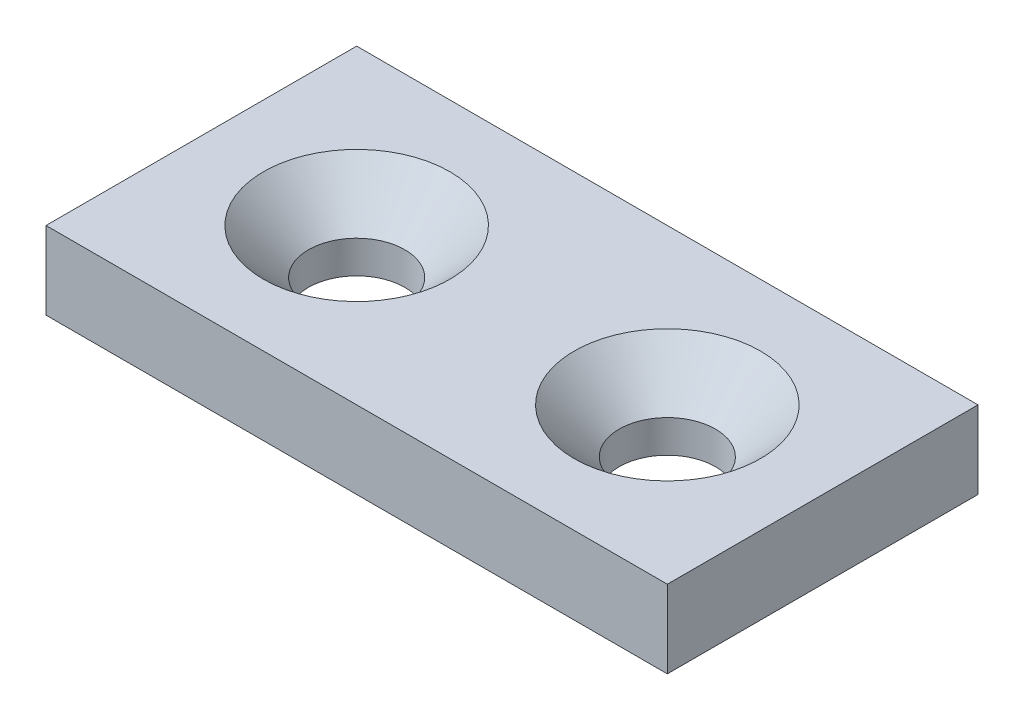
ISO-10303-21;
HEADER;
FILE_DESCRIPTION(('STEP AP214'),'2;1');
FILE_NAME('part.step','',(''),(''),'','','');
FILE_SCHEMA(('AUTOMOTIVE_DESIGN { 1 0 10303 214 1 1 1 1 }'));
ENDSEC;
DATA;
#1=APPLICATION_CONTEXT('core data for automotive mechanical design processes');
#2=APPLICATION_PROTOCOL_DEFINITION('international standard','automotive_design',2000,#1);
#3=PRODUCT_CONTEXT('',#1,'mechanical');
#4=PRODUCT('Part','Part','',(#3));
#5=PRODUCT_RELATED_PRODUCT_CATEGORY('part','',(#4));
#6=PRODUCT_DEFINITION_FORMATION('','',#4);
#7=PRODUCT_DEFINITION_CONTEXT('part definition',#1,'design');
#8=PRODUCT_DEFINITION('design','',#6,#7);
#9=PRODUCT_DEFINITION_SHAPE('','',#8);
#10=(LENGTH_UNIT() NAMED_UNIT(*) SI_UNIT(.MILLI.,.METRE.));
#11=(NAMED_UNIT(*) PLANE_ANGLE_UNIT() SI_UNIT($,.RADIAN.));
#12=(NAMED_UNIT(*) SI_UNIT($,.STERADIAN.) SOLID_ANGLE_UNIT());
#13=UNCERTAINTY_MEASURE_WITH_UNIT(LENGTH_MEASURE(1.E-05),#10,'distance_accuracy_value','');
#14=(GEOMETRIC_REPRESENTATION_CONTEXT(3) GLOBAL_UNCERTAINTY_ASSIGNED_CONTEXT((#13)) GLOBAL_UNIT_ASSIGNED_CONTEXT((#10,
#11,#12)) REPRESENTATION_CONTEXT('',''));
#15=CARTESIAN_POINT('',(0.,0.,0.));
#16=DIRECTION('',(0.,0.,1.));
#17=DIRECTION('',(1.,0.,0.));
#18=AXIS2_PLACEMENT_3D('',#15,#16,#17);
#19=CARTESIAN_POINT('',(0.,5.,0.));
#20=DIRECTION('',(0.,-1.,0.));
#21=DIRECTION('',(0.,0.,-1.));
#22=AXIS2_PLACEMENT_3D('',#19,#20,#21);
#23=PLANE('',#22);
#24=CARTESIAN_POINT('',(10.,5.,0.));
#25=DIRECTION('',(0.,1.,0.));
#26=DIRECTION('',(0.,0.,1.));
#27=AXIS2_PLACEMENT_3D('',#24,#25,#26);
#28=CIRCLE('',#27,6.);
#29=CARTESIAN_POINT('',(10.,5.,6.));
#30=VERTEX_POINT('',#29);
#31=EDGE_CURVE('E117',#30,#30,#28,.T.);
#32=ORIENTED_EDGE('',*,*,#31,.F.);
#33=EDGE_LOOP('',(#32));
#34=FACE_BOUND('',#33,.T.);
#35=DIRECTION('',(0.,0.,-1.));
#36=VECTOR('',#35,1.);
#37=CARTESIAN_POINT('',(20.,5.,10.));
#38=LINE('',#37,#36);
#39=CARTESIAN_POINT('',(20.,5.,10.));
#40=VERTEX_POINT('',#39);
#41=CARTESIAN_POINT('',(20.,5.,-10.));
#42=VERTEX_POINT('',#41);
#43=EDGE_CURVE('E86',#40,#42,#38,.T.);
#44=ORIENTED_EDGE('',*,*,#43,.T.);
#45=DIRECTION('',(-1.,0.,0.));
#46=VECTOR('',#45,1.);
#47=CARTESIAN_POINT('',(-20.,5.,-10.));
#48=LINE('',#47,#46);
#49=CARTESIAN_POINT('',(-20.,5.,-10.));
#50=VERTEX_POINT('',#49);
#51=EDGE_CURVE('E81',#42,#50,#48,.T.);
#52=ORIENTED_EDGE('',*,*,#51,.T.);
#53=DIRECTION('',(0.,0.,1.));
#54=VECTOR('',#53,1.);
#55=CARTESIAN_POINT('',(-20.,5.,10.));
#56=LINE('',#55,#54);
#57=CARTESIAN_POINT('',(-20.,5.,10.));
#58=VERTEX_POINT('',#57);
#59=EDGE_CURVE('E84',#50,#58,#56,.T.);
#60=ORIENTED_EDGE('',*,*,#59,.T.);
#61=DIRECTION('',(1.,0.,0.));
#62=VECTOR('',#61,1.);
#63=CARTESIAN_POINT('',(-20.,5.,10.));
#64=LINE('',#63,#62);
#65=EDGE_CURVE('E51',#58,#40,#64,.T.);
#66=ORIENTED_EDGE('',*,*,#65,.T.);
#67=EDGE_LOOP('',(#44,#52,#60,#66));
#68=FACE_BOUND('',#67,.T.);
#69=CARTESIAN_POINT('',(-10.,5.,0.));
#70=DIRECTION('',(0.,1.,0.));
#71=DIRECTION('',(0.,0.,1.));
#72=AXIS2_PLACEMENT_3D('',#69,#70,#71);
#73=CIRCLE('',#72,6.);
#74=CARTESIAN_POINT('',(-10.,5.,6.));
#75=VERTEX_POINT('',#74);
#76=EDGE_CURVE('E126',#75,#75,#73,.T.);
#77=ORIENTED_EDGE('',*,*,#76,.F.);
#78=EDGE_LOOP('',(#77));
#79=FACE_BOUND('',#78,.T.);
#80=ADVANCED_FACE('F34',(#34,#68,#79),#23,.F.);
#81=CARTESIAN_POINT('',(20.,5.,10.));
#82=DIRECTION('',(-1.,0.,0.));
#83=DIRECTION('',(0.,0.,1.));
#84=AXIS2_PLACEMENT_3D('',#81,#82,#83);
#85=PLANE('',#84);
#86=DIRECTION('',(0.,0.,-1.));
#87=VECTOR('',#86,1.);
#88=CARTESIAN_POINT('',(20.,0.,10.));
#89=LINE('',#88,#87);
#90=CARTESIAN_POINT('',(20.,0.,10.));
#91=VERTEX_POINT('',#90);
#92=CARTESIAN_POINT('',(20.,0.,-10.));
#93=VERTEX_POINT('',#92);
#94=EDGE_CURVE('E98',#91,#93,#89,.T.);
#95=ORIENTED_EDGE('',*,*,#94,.T.);
#96=DIRECTION('',(0.,-1.,0.));
#97=VECTOR('',#96,1.);
#98=CARTESIAN_POINT('',(20.,5.,-10.));
#99=LINE('',#98,#97);
#100=EDGE_CURVE('E11',#42,#93,#99,.T.);
#101=ORIENTED_EDGE('',*,*,#100,.F.);
#102=ORIENTED_EDGE('',*,*,#43,.F.);
#103=DIRECTION('',(0.,-1.,0.));
#104=VECTOR('',#103,1.);
#105=CARTESIAN_POINT('',(20.,5.,10.));
#106=LINE('',#105,#104);
#107=EDGE_CURVE('E94',#40,#91,#106,.T.);
#108=ORIENTED_EDGE('',*,*,#107,.T.);
#109=EDGE_LOOP('',(#95,#101,#102,#108));
#110=FACE_BOUND('',#109,.T.);
#111=ADVANCED_FACE('F36',(#110),#85,.F.);
#112=CARTESIAN_POINT('',(-20.,5.,-10.));
#113=DIRECTION('',(0.,0.,1.));
#114=DIRECTION('',(1.,0.,0.));
#115=AXIS2_PLACEMENT_3D('',#112,#113,#114);
#116=PLANE('',#115);
#117=DIRECTION('',(-1.,0.,0.));
#118=VECTOR('',#117,1.);
#119=CARTESIAN_POINT('',(-20.,0.,-10.));
#120=LINE('',#119,#118);
#121=CARTESIAN_POINT('',(-20.,0.,-10.));
#122=VERTEX_POINT('',#121);
#123=EDGE_CURVE('E90',#93,#122,#120,.T.);
#124=ORIENTED_EDGE('',*,*,#123,.T.);
#125=DIRECTION('',(0.,-1.,0.));
#126=VECTOR('',#125,1.);
#127=CARTESIAN_POINT('',(-20.,5.,-10.));
#128=LINE('',#127,#126);
#129=EDGE_CURVE('E43',#50,#122,#128,.T.);
#130=ORIENTED_EDGE('',*,*,#129,.F.);
#131=ORIENTED_EDGE('',*,*,#51,.F.);
#132=ORIENTED_EDGE('',*,*,#100,.T.);
#133=EDGE_LOOP('',(#124,#130,#131,#132));
#134=FACE_BOUND('',#133,.T.);
#135=ADVANCED_FACE('F89',(#134),#116,.F.);
#136=CARTESIAN_POINT('',(-20.,5.,10.));
#137=DIRECTION('',(1.,0.,0.));
#138=DIRECTION('',(0.,0.,-1.));
#139=AXIS2_PLACEMENT_3D('',#136,#137,#138);
#140=PLANE('',#139);
#141=DIRECTION('',(0.,0.,1.));
#142=VECTOR('',#141,1.);
#143=CARTESIAN_POINT('',(-20.,0.,10.));
#144=LINE('',#143,#142);
#145=CARTESIAN_POINT('',(-20.,0.,10.));
#146=VERTEX_POINT('',#145);
#147=EDGE_CURVE('E68',#122,#146,#144,.T.);
#148=ORIENTED_EDGE('',*,*,#147,.T.);
#149=DIRECTION('',(0.,-1.,0.));
#150=VECTOR('',#149,1.);
#151=CARTESIAN_POINT('',(-20.,5.,10.));
#152=LINE('',#151,#150);
#153=EDGE_CURVE('E91',#58,#146,#152,.T.);
#154=ORIENTED_EDGE('',*,*,#153,.F.);
#155=ORIENTED_EDGE('',*,*,#59,.F.);
#156=ORIENTED_EDGE('',*,*,#129,.T.);
#157=EDGE_LOOP('',(#148,#154,#155,#156));
#158=FACE_BOUND('',#157,.T.);
#159=ADVANCED_FACE('F92',(#158),#140,.F.);
#160=CARTESIAN_POINT('',(-20.,5.,10.));
#161=DIRECTION('',(0.,0.,-1.));
#162=DIRECTION('',(-1.,0.,0.));
#163=AXIS2_PLACEMENT_3D('',#160,#161,#162);
#164=PLANE('',#163);
#165=DIRECTION('',(1.,0.,0.));
#166=VECTOR('',#165,1.);
#167=CARTESIAN_POINT('',(-20.,0.,10.));
#168=LINE('',#167,#166);
#169=EDGE_CURVE('E74',#146,#91,#168,.T.);
#170=ORIENTED_EDGE('',*,*,#169,.T.);
#171=ORIENTED_EDGE('',*,*,#107,.F.);
#172=ORIENTED_EDGE('',*,*,#65,.F.);
#173=ORIENTED_EDGE('',*,*,#153,.T.);
#174=EDGE_LOOP('',(#170,#171,#172,#173));
#175=FACE_BOUND('',#174,.T.);
#176=ADVANCED_FACE('F106',(#175),#164,.F.);
#177=CARTESIAN_POINT('',(0.,0.,0.));
#178=DIRECTION('',(0.,-1.,0.));
#179=DIRECTION('',(0.,0.,-1.));
#180=AXIS2_PLACEMENT_3D('',#177,#178,#179);
#181=PLANE('',#180);
#182=CARTESIAN_POINT('',(-10.,0.,0.));
#183=DIRECTION('',(0.,-1.,0.));
#184=DIRECTION('',(0.,0.,-1.));
#185=AXIS2_PLACEMENT_3D('',#182,#183,#184);
#186=CIRCLE('',#185,3.1);
#187=CARTESIAN_POINT('',(-10.,0.,-3.1));
#188=VERTEX_POINT('',#187);
#189=EDGE_CURVE('E120',#188,#188,#186,.T.);
#190=ORIENTED_EDGE('',*,*,#189,.F.);
#191=EDGE_LOOP('',(#190));
#192=FACE_BOUND('',#191,.T.);
#193=CARTESIAN_POINT('',(10.,0.,0.));
#194=DIRECTION('',(0.,-1.,0.));
#195=DIRECTION('',(0.,0.,-1.));
#196=AXIS2_PLACEMENT_3D('',#193,#194,#195);
#197=CIRCLE('',#196,3.1);
#198=CARTESIAN_POINT('',(10.,0.,-3.1));
#199=VERTEX_POINT('',#198);
#200=EDGE_CURVE('E101',#199,#199,#197,.T.);
#201=ORIENTED_EDGE('',*,*,#200,.F.);
#202=EDGE_LOOP('',(#201));
#203=FACE_BOUND('',#202,.T.);
#204=ORIENTED_EDGE('',*,*,#94,.F.);
#205=ORIENTED_EDGE('',*,*,#169,.F.);
#206=ORIENTED_EDGE('',*,*,#147,.F.);
#207=ORIENTED_EDGE('',*,*,#123,.F.);
#208=EDGE_LOOP('',(#204,#205,#206,#207));
#209=FACE_BOUND('',#208,.T.);
#210=ADVANCED_FACE('F109',(#192,#203,#209),#181,.T.);
#211=CARTESIAN_POINT('',(10.,5.,0.));
#212=DIRECTION('',(0.,1.,0.));
#213=DIRECTION('',(0.,0.,1.));
#214=AXIS2_PLACEMENT_3D('',#211,#212,#213);
#215=CYLINDRICAL_SURFACE('',#214,3.1);
#216=CARTESIAN_POINT('',(10.,2.1,0.));
#217=DIRECTION('',(0.,1.,0.));
#218=DIRECTION('',(0.,0.,1.));
#219=AXIS2_PLACEMENT_3D('',#216,#217,#218);
#220=CIRCLE('',#219,3.1);
#221=CARTESIAN_POINT('',(10.,2.1,3.1));
#222=VERTEX_POINT('',#221);
#223=EDGE_CURVE('E114',#222,#222,#220,.T.);
#224=ORIENTED_EDGE('',*,*,#223,.T.);
#225=EDGE_LOOP('',(#224));
#226=FACE_BOUND('',#225,.T.);
#227=ORIENTED_EDGE('',*,*,#200,.T.);
#228=EDGE_LOOP('',(#227));
#229=FACE_BOUND('',#228,.T.);
#230=ADVANCED_FACE('F140',(#226,#229),#215,.F.);
#231=CARTESIAN_POINT('',(10.,5.,0.));
#232=DIRECTION('',(0.,1.,0.));
#233=DIRECTION('',(0.,0.,1.));
#234=AXIS2_PLACEMENT_3D('',#231,#232,#233);
#235=CONICAL_SURFACE('',#234,6.,0.785398163397448);
#236=ORIENTED_EDGE('',*,*,#223,.F.);
#237=EDGE_LOOP('',(#236));
#238=FACE_BOUND('',#237,.T.);
#239=ORIENTED_EDGE('',*,*,#31,.T.);
#240=EDGE_LOOP('',(#239));
#241=FACE_BOUND('',#240,.T.);
#242=ADVANCED_FACE('F171',(#238,#241),#235,.F.);
#243=CARTESIAN_POINT('',(-10.,5.,0.));
#244=DIRECTION('',(0.,1.,0.));
#245=DIRECTION('',(0.,0.,1.));
#246=AXIS2_PLACEMENT_3D('',#243,#244,#245);
#247=CYLINDRICAL_SURFACE('',#246,3.1);
#248=CARTESIAN_POINT('',(-10.,2.1,0.));
#249=DIRECTION('',(0.,1.,0.));
#250=DIRECTION('',(0.,0.,1.));
#251=AXIS2_PLACEMENT_3D('',#248,#249,#250);
#252=CIRCLE('',#251,3.1);
#253=CARTESIAN_POINT('',(-10.,2.1,3.1));
#254=VERTEX_POINT('',#253);
#255=EDGE_CURVE('E123',#254,#254,#252,.T.);
#256=ORIENTED_EDGE('',*,*,#255,.T.);
#257=EDGE_LOOP('',(#256));
#258=FACE_BOUND('',#257,.T.);
#259=ORIENTED_EDGE('',*,*,#189,.T.);
#260=EDGE_LOOP('',(#259));
#261=FACE_BOUND('',#260,.T.);
#262=ADVANCED_FACE('F178',(#258,#261),#247,.F.);
#263=CARTESIAN_POINT('',(-10.,5.,0.));
#264=DIRECTION('',(0.,1.,0.));
#265=DIRECTION('',(0.,0.,1.));
#266=AXIS2_PLACEMENT_3D('',#263,#264,#265);
#267=CONICAL_SURFACE('',#266,6.,0.785398163397448);
#268=ORIENTED_EDGE('',*,*,#255,.F.);
#269=EDGE_LOOP('',(#268));
#270=FACE_BOUND('',#269,.T.);
#271=ORIENTED_EDGE('',*,*,#76,.T.);
#272=EDGE_LOOP('',(#271));
#273=FACE_BOUND('',#272,.T.);
#274=ADVANCED_FACE('F130',(#270,#273),#267,.F.);
#275=CLOSED_SHELL('',(#80,#111,#135,#159,#176,#210,#230,#242,#262,#274));
#276=MANIFOLD_SOLID_BREP('B2',#275);
#277=ADVANCED_BREP_SHAPE_REPRESENTATION('',(#18,#276),#14);
#278=SHAPE_DEFINITION_REPRESENTATION(#9,#277);
ENDSEC;
END-ISO-10303-21;
